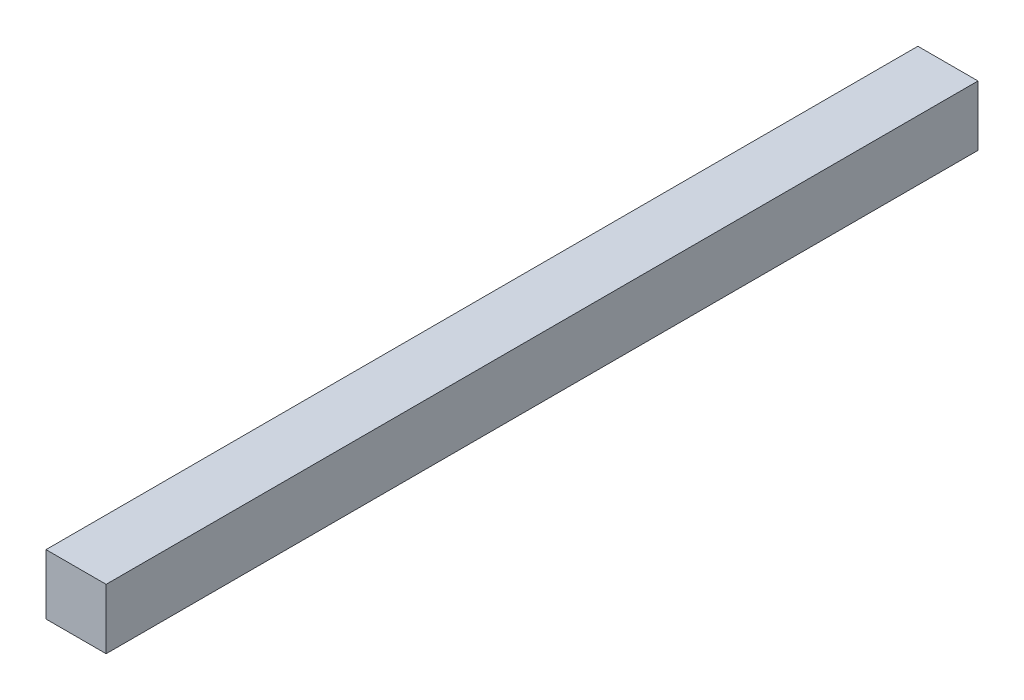
ISO-10303-21;
HEADER;
FILE_DESCRIPTION(('STEP AP214'),'2;1');
FILE_NAME('part.step','',(''),(''),'','','');
FILE_SCHEMA(('AUTOMOTIVE_DESIGN { 1 0 10303 214 1 1 1 1 }'));
ENDSEC;
DATA;
#1=APPLICATION_CONTEXT('core data for automotive mechanical design processes');
#2=APPLICATION_PROTOCOL_DEFINITION('international standard','automotive_design',2000,#1);
#3=PRODUCT_CONTEXT('',#1,'mechanical');
#4=PRODUCT('Part','Part','',(#3));
#5=PRODUCT_RELATED_PRODUCT_CATEGORY('part','',(#4));
#6=PRODUCT_DEFINITION_FORMATION('','',#4);
#7=PRODUCT_DEFINITION_CONTEXT('part definition',#1,'design');
#8=PRODUCT_DEFINITION('design','',#6,#7);
#9=PRODUCT_DEFINITION_SHAPE('','',#8);
#10=(LENGTH_UNIT() NAMED_UNIT(*) SI_UNIT(.MILLI.,.METRE.));
#11=(NAMED_UNIT(*) PLANE_ANGLE_UNIT() SI_UNIT($,.RADIAN.));
#12=(NAMED_UNIT(*) SI_UNIT($,.STERADIAN.) SOLID_ANGLE_UNIT());
#13=UNCERTAINTY_MEASURE_WITH_UNIT(LENGTH_MEASURE(1.E-05),#10,'distance_accuracy_value','');
#14=(GEOMETRIC_REPRESENTATION_CONTEXT(3) GLOBAL_UNCERTAINTY_ASSIGNED_CONTEXT((#13)) GLOBAL_UNIT_ASSIGNED_CONTEXT((#10,
#11,#12)) REPRESENTATION_CONTEXT('',''));
#15=CARTESIAN_POINT('',(0.,0.,0.));
#16=DIRECTION('',(0.,0.,1.));
#17=DIRECTION('',(1.,0.,0.));
#18=AXIS2_PLACEMENT_3D('',#15,#16,#17);
#19=CARTESIAN_POINT('',(10.,-10.,290.));
#20=DIRECTION('',(-1.,0.,0.));
#21=DIRECTION('',(0.,0.,1.));
#22=AXIS2_PLACEMENT_3D('',#19,#20,#21);
#23=PLANE('',#22);
#24=DIRECTION('',(0.,1.,0.));
#25=VECTOR('',#24,1.);
#26=CARTESIAN_POINT('',(10.,-10.,0.));
#27=LINE('',#26,#25);
#28=CARTESIAN_POINT('',(10.,-10.,0.));
#29=VERTEX_POINT('',#28);
#30=CARTESIAN_POINT('',(10.,10.,0.));
#31=VERTEX_POINT('',#30);
#32=EDGE_CURVE('E96',#29,#31,#27,.T.);
#33=ORIENTED_EDGE('',*,*,#32,.T.);
#34=DIRECTION('',(0.,0.,-1.));
#35=VECTOR('',#34,1.);
#36=CARTESIAN_POINT('',(10.,10.,290.));
#37=LINE('',#36,#35);
#38=CARTESIAN_POINT('',(10.,10.,290.));
#39=VERTEX_POINT('',#38);
#40=EDGE_CURVE('E11',#39,#31,#37,.T.);
#41=ORIENTED_EDGE('',*,*,#40,.F.);
#42=DIRECTION('',(0.,1.,0.));
#43=VECTOR('',#42,1.);
#44=CARTESIAN_POINT('',(10.,-10.,290.));
#45=LINE('',#44,#43);
#46=CARTESIAN_POINT('',(10.,-10.,290.));
#47=VERTEX_POINT('',#46);
#48=EDGE_CURVE('E84',#47,#39,#45,.T.);
#49=ORIENTED_EDGE('',*,*,#48,.F.);
#50=DIRECTION('',(0.,0.,-1.));
#51=VECTOR('',#50,1.);
#52=CARTESIAN_POINT('',(10.,-10.,290.));
#53=LINE('',#52,#51);
#54=EDGE_CURVE('E92',#47,#29,#53,.T.);
#55=ORIENTED_EDGE('',*,*,#54,.T.);
#56=EDGE_LOOP('',(#33,#41,#49,#55));
#57=FACE_BOUND('',#56,.T.);
#58=ADVANCED_FACE('F33',(#57),#23,.F.);
#59=CARTESIAN_POINT('',(-10.,10.,290.));
#60=DIRECTION('',(0.,-1.,0.));
#61=DIRECTION('',(0.,0.,-1.));
#62=AXIS2_PLACEMENT_3D('',#59,#60,#61);
#63=PLANE('',#62);
#64=DIRECTION('',(-1.,0.,0.));
#65=VECTOR('',#64,1.);
#66=CARTESIAN_POINT('',(-10.,10.,0.));
#67=LINE('',#66,#65);
#68=CARTESIAN_POINT('',(-10.,10.,0.));
#69=VERTEX_POINT('',#68);
#70=EDGE_CURVE('E88',#31,#69,#67,.T.);
#71=ORIENTED_EDGE('',*,*,#70,.T.);
#72=DIRECTION('',(0.,0.,-1.));
#73=VECTOR('',#72,1.);
#74=CARTESIAN_POINT('',(-10.,10.,290.));
#75=LINE('',#74,#73);
#76=CARTESIAN_POINT('',(-10.,10.,290.));
#77=VERTEX_POINT('',#76);
#78=EDGE_CURVE('E41',#77,#69,#75,.T.);
#79=ORIENTED_EDGE('',*,*,#78,.F.);
#80=DIRECTION('',(-1.,0.,0.));
#81=VECTOR('',#80,1.);
#82=CARTESIAN_POINT('',(-10.,10.,290.));
#83=LINE('',#82,#81);
#84=EDGE_CURVE('E79',#39,#77,#83,.T.);
#85=ORIENTED_EDGE('',*,*,#84,.F.);
#86=ORIENTED_EDGE('',*,*,#40,.T.);
#87=EDGE_LOOP('',(#71,#79,#85,#86));
#88=FACE_BOUND('',#87,.T.);
#89=ADVANCED_FACE('F87',(#88),#63,.F.);
#90=CARTESIAN_POINT('',(-10.,-10.,290.));
#91=DIRECTION('',(1.,0.,0.));
#92=DIRECTION('',(0.,0.,-1.));
#93=AXIS2_PLACEMENT_3D('',#90,#91,#92);
#94=PLANE('',#93);
#95=DIRECTION('',(0.,-1.,0.));
#96=VECTOR('',#95,1.);
#97=CARTESIAN_POINT('',(-10.,-10.,0.));
#98=LINE('',#97,#96);
#99=CARTESIAN_POINT('',(-10.,-10.,0.));
#100=VERTEX_POINT('',#99);
#101=EDGE_CURVE('E66',#69,#100,#98,.T.);
#102=ORIENTED_EDGE('',*,*,#101,.T.);
#103=DIRECTION('',(0.,0.,-1.));
#104=VECTOR('',#103,1.);
#105=CARTESIAN_POINT('',(-10.,-10.,290.));
#106=LINE('',#105,#104);
#107=CARTESIAN_POINT('',(-10.,-10.,290.));
#108=VERTEX_POINT('',#107);
#109=EDGE_CURVE('E89',#108,#100,#106,.T.);
#110=ORIENTED_EDGE('',*,*,#109,.F.);
#111=DIRECTION('',(0.,-1.,0.));
#112=VECTOR('',#111,1.);
#113=CARTESIAN_POINT('',(-10.,-10.,290.));
#114=LINE('',#113,#112);
#115=EDGE_CURVE('E82',#77,#108,#114,.T.);
#116=ORIENTED_EDGE('',*,*,#115,.F.);
#117=ORIENTED_EDGE('',*,*,#78,.T.);
#118=EDGE_LOOP('',(#102,#110,#116,#117));
#119=FACE_BOUND('',#118,.T.);
#120=ADVANCED_FACE('F90',(#119),#94,.F.);
#121=CARTESIAN_POINT('',(-10.,-10.,290.));
#122=DIRECTION('',(0.,1.,0.));
#123=DIRECTION('',(0.,0.,1.));
#124=AXIS2_PLACEMENT_3D('',#121,#122,#123);
#125=PLANE('',#124);
#126=DIRECTION('',(1.,0.,0.));
#127=VECTOR('',#126,1.);
#128=CARTESIAN_POINT('',(-10.,-10.,0.));
#129=LINE('',#128,#127);
#130=EDGE_CURVE('E72',#100,#29,#129,.T.);
#131=ORIENTED_EDGE('',*,*,#130,.T.);
#132=ORIENTED_EDGE('',*,*,#54,.F.);
#133=DIRECTION('',(1.,0.,0.));
#134=VECTOR('',#133,1.);
#135=CARTESIAN_POINT('',(-10.,-10.,290.));
#136=LINE('',#135,#134);
#137=EDGE_CURVE('E49',#108,#47,#136,.T.);
#138=ORIENTED_EDGE('',*,*,#137,.F.);
#139=ORIENTED_EDGE('',*,*,#109,.T.);
#140=EDGE_LOOP('',(#131,#132,#138,#139));
#141=FACE_BOUND('',#140,.T.);
#142=ADVANCED_FACE('F103',(#141),#125,.F.);
#143=CARTESIAN_POINT('',(0.,0.,290.));
#144=DIRECTION('',(0.,0.,-1.));
#145=DIRECTION('',(-1.,0.,0.));
#146=AXIS2_PLACEMENT_3D('',#143,#144,#145);
#147=PLANE('',#146);
#148=ORIENTED_EDGE('',*,*,#48,.T.);
#149=ORIENTED_EDGE('',*,*,#84,.T.);
#150=ORIENTED_EDGE('',*,*,#115,.T.);
#151=ORIENTED_EDGE('',*,*,#137,.T.);
#152=EDGE_LOOP('',(#148,#149,#150,#151));
#153=FACE_BOUND('',#152,.T.);
#154=ADVANCED_FACE('F80',(#153),#147,.F.);
#155=CARTESIAN_POINT('',(0.,0.,0.));
#156=DIRECTION('',(0.,0.,-1.));
#157=DIRECTION('',(-1.,0.,0.));
#158=AXIS2_PLACEMENT_3D('',#155,#156,#157);
#159=PLANE('',#158);
#160=ORIENTED_EDGE('',*,*,#32,.F.);
#161=ORIENTED_EDGE('',*,*,#130,.F.);
#162=ORIENTED_EDGE('',*,*,#101,.F.);
#163=ORIENTED_EDGE('',*,*,#70,.F.);
#164=EDGE_LOOP('',(#160,#161,#162,#163));
#165=FACE_BOUND('',#164,.T.);
#166=ADVANCED_FACE('F106',(#165),#159,.T.);
#167=CLOSED_SHELL('',(#58,#89,#120,#142,#154,#166));
#168=MANIFOLD_SOLID_BREP('B2',#167);
#169=ADVANCED_BREP_SHAPE_REPRESENTATION('',(#18,#168),#14);
#170=SHAPE_DEFINITION_REPRESENTATION(#9,#169);
ENDSEC;
END-ISO-10303-21;
